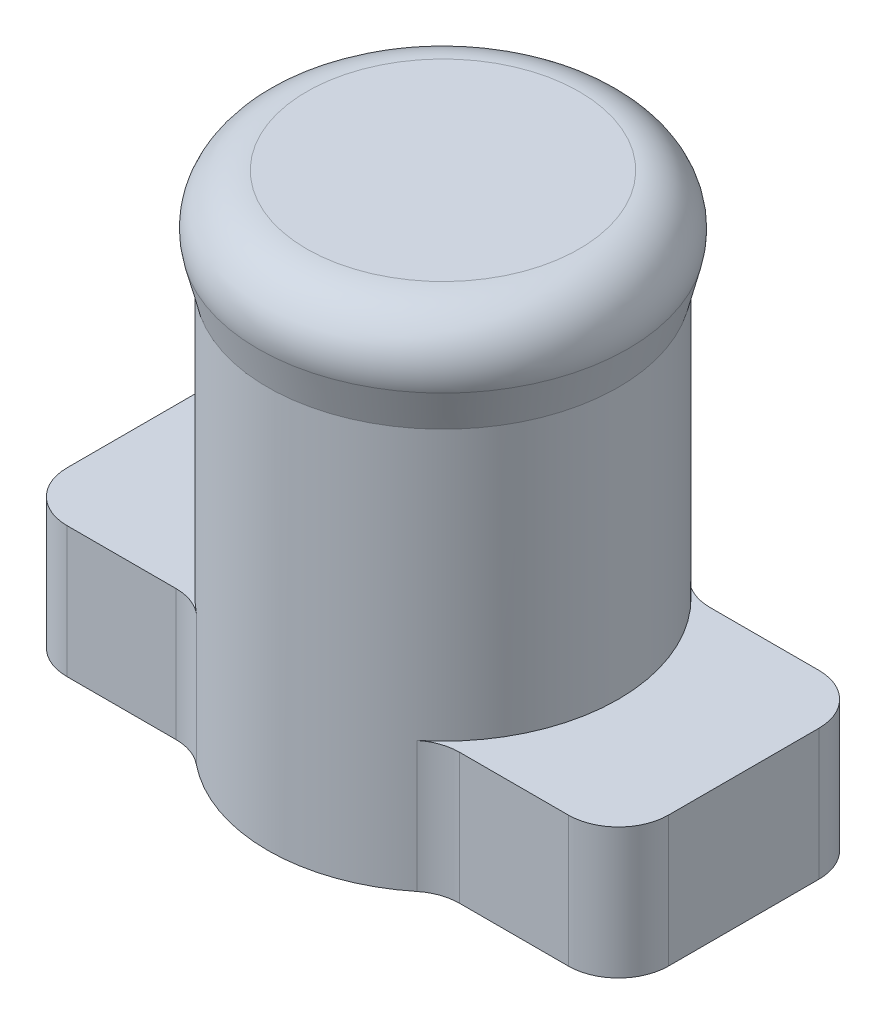
ISO-10303-21;
HEADER;
FILE_DESCRIPTION(('STEP AP214'),'2;1');
FILE_NAME('part.step','',(''),(''),'','','');
FILE_SCHEMA(('AUTOMOTIVE_DESIGN { 1 0 10303 214 1 1 1 1 }'));
ENDSEC;
DATA;
#1=APPLICATION_CONTEXT('core data for automotive mechanical design processes');
#2=APPLICATION_PROTOCOL_DEFINITION('international standard','automotive_design',2000,#1);
#3=PRODUCT_CONTEXT('',#1,'mechanical');
#4=PRODUCT('Part','Part','',(#3));
#5=PRODUCT_RELATED_PRODUCT_CATEGORY('part','',(#4));
#6=PRODUCT_DEFINITION_FORMATION('','',#4);
#7=PRODUCT_DEFINITION_CONTEXT('part definition',#1,'design');
#8=PRODUCT_DEFINITION('design','',#6,#7);
#9=PRODUCT_DEFINITION_SHAPE('','',#8);
#10=(LENGTH_UNIT() NAMED_UNIT(*) SI_UNIT(.MILLI.,.METRE.));
#11=(NAMED_UNIT(*) PLANE_ANGLE_UNIT() SI_UNIT($,.RADIAN.));
#12=(NAMED_UNIT(*) SI_UNIT($,.STERADIAN.) SOLID_ANGLE_UNIT());
#13=UNCERTAINTY_MEASURE_WITH_UNIT(LENGTH_MEASURE(1.E-05),#10,'distance_accuracy_value','');
#14=(GEOMETRIC_REPRESENTATION_CONTEXT(3) GLOBAL_UNCERTAINTY_ASSIGNED_CONTEXT((#13)) GLOBAL_UNIT_ASSIGNED_CONTEXT((#10,
#11,#12)) REPRESENTATION_CONTEXT('',''));
#15=CARTESIAN_POINT('',(0.,0.,0.));
#16=DIRECTION('',(0.,0.,1.));
#17=DIRECTION('',(1.,0.,0.));
#18=AXIS2_PLACEMENT_3D('',#15,#16,#17);
#19=CARTESIAN_POINT('',(0.,0.,0.));
#20=DIRECTION('',(0.,-1.,0.));
#21=DIRECTION('',(0.,0.,-1.));
#22=AXIS2_PLACEMENT_3D('',#19,#20,#21);
#23=CYLINDRICAL_SURFACE('',#22,3.5);
#24=CARTESIAN_POINT('',(0.,8.,0.));
#25=DIRECTION('',(0.,-1.,0.));
#26=DIRECTION('',(0.,0.,-1.));
#27=AXIS2_PLACEMENT_3D('',#24,#25,#26);
#28=CIRCLE('',#27,3.5);
#29=CARTESIAN_POINT('',(0.,8.,-3.5));
#30=VERTEX_POINT('',#29);
#31=EDGE_CURVE('E221',#30,#30,#28,.T.);
#32=ORIENTED_EDGE('',*,*,#31,.T.);
#33=EDGE_LOOP('',(#32));
#34=FACE_BOUND('',#33,.T.);
#35=CARTESIAN_POINT('',(0.,0.,0.));
#36=DIRECTION('',(0.,-1.,0.));
#37=DIRECTION('',(0.,0.,-1.));
#38=AXIS2_PLACEMENT_3D('',#35,#36,#37);
#39=CIRCLE('',#38,3.5);
#40=CARTESIAN_POINT('',(2.19988776369148,0.,2.72222222222222));
#41=VERTEX_POINT('',#40);
#42=CARTESIAN_POINT('',(-2.19988776369148,0.,2.72222222222222));
#43=VERTEX_POINT('',#42);
#44=EDGE_CURVE('E214',#41,#43,#39,.T.);
#45=ORIENTED_EDGE('',*,*,#44,.F.);
#46=DIRECTION('',(0.,-1.,0.));
#47=VECTOR('',#46,1.);
#48=CARTESIAN_POINT('',(2.19988776369148,0.,2.72222222222222));
#49=LINE('',#48,#47);
#50=CARTESIAN_POINT('',(2.19988776369148,2.61000000000006,2.72222222222222));
#51=VERTEX_POINT('',#50);
#52=EDGE_CURVE('E239',#41,#51,#49,.F.);
#53=ORIENTED_EDGE('',*,*,#52,.T.);
#54=CARTESIAN_POINT('',(0.,2.61000000000006,0.));
#55=DIRECTION('',(0.,1.,0.));
#56=DIRECTION('',(0.,0.,1.));
#57=AXIS2_PLACEMENT_3D('',#54,#55,#56);
#58=CIRCLE('',#57,3.5);
#59=CARTESIAN_POINT('',(2.19988776369148,2.61000000000006,-2.72222222222222));
#60=VERTEX_POINT('',#59);
#61=EDGE_CURVE('E323',#60,#51,#58,.F.);
#62=ORIENTED_EDGE('',*,*,#61,.F.);
#63=DIRECTION('',(0.,-1.,0.));
#64=VECTOR('',#63,1.);
#65=CARTESIAN_POINT('',(2.19988776369148,0.,-2.72222222222222));
#66=LINE('',#65,#64);
#67=CARTESIAN_POINT('',(2.19988776369148,0.,-2.72222222222222));
#68=VERTEX_POINT('',#67);
#69=EDGE_CURVE('E236',#60,#68,#66,.T.);
#70=ORIENTED_EDGE('',*,*,#69,.T.);
#71=CARTESIAN_POINT('',(-2.19988776369148,0.,-2.72222222222222));
#72=VERTEX_POINT('',#71);
#73=EDGE_CURVE('E218',#72,#68,#39,.T.);
#74=ORIENTED_EDGE('',*,*,#73,.F.);
#75=DIRECTION('',(0.,-1.,0.));
#76=VECTOR('',#75,1.);
#77=CARTESIAN_POINT('',(-2.19988776369148,0.,-2.72222222222222));
#78=LINE('',#77,#76);
#79=CARTESIAN_POINT('',(-2.19988776369148,2.61000000000006,-2.72222222222222));
#80=VERTEX_POINT('',#79);
#81=EDGE_CURVE('E233',#72,#80,#78,.F.);
#82=ORIENTED_EDGE('',*,*,#81,.T.);
#83=CARTESIAN_POINT('',(0.,2.61000000000006,0.));
#84=DIRECTION('',(0.,-1.,0.));
#85=DIRECTION('',(0.,0.,-1.));
#86=AXIS2_PLACEMENT_3D('',#83,#84,#85);
#87=CIRCLE('',#86,3.5);
#88=CARTESIAN_POINT('',(-2.19988776369148,2.61000000000006,2.72222222222222));
#89=VERTEX_POINT('',#88);
#90=EDGE_CURVE('E202',#80,#89,#87,.F.);
#91=ORIENTED_EDGE('',*,*,#90,.T.);
#92=DIRECTION('',(0.,-1.,0.));
#93=VECTOR('',#92,1.);
#94=CARTESIAN_POINT('',(-2.19988776369148,0.,2.72222222222222));
#95=LINE('',#94,#93);
#96=EDGE_CURVE('E230',#89,#43,#95,.T.);
#97=ORIENTED_EDGE('',*,*,#96,.T.);
#98=EDGE_LOOP('',(#45,#53,#62,#70,#74,#82,#91,#97));
#99=FACE_BOUND('',#98,.T.);
#100=ADVANCED_FACE('F33',(#34,#99),#23,.T.);
#101=CARTESIAN_POINT('',(3.5,0.,0.));
#102=DIRECTION('',(0.,-1.,0.));
#103=DIRECTION('',(0.,0.,-1.));
#104=AXIS2_PLACEMENT_3D('',#101,#102,#103);
#105=PLANE('',#104);
#106=DIRECTION('',(0.,0.,1.));
#107=VECTOR('',#106,1.);
#108=CARTESIAN_POINT('',(1.80000000000002,0.,-1.79999999999998));
#109=LINE('',#108,#107);
#110=CARTESIAN_POINT('',(1.80000000000002,0.,-1.79999999999998));
#111=VERTEX_POINT('',#110);
#112=CARTESIAN_POINT('',(1.80000000000002,0.,1.80000000000002));
#113=VERTEX_POINT('',#112);
#114=EDGE_CURVE('E179',#111,#113,#109,.T.);
#115=ORIENTED_EDGE('',*,*,#114,.F.);
#116=DIRECTION('',(1.,0.,0.));
#117=VECTOR('',#116,1.);
#118=CARTESIAN_POINT('',(-1.79999999999998,0.,-1.79999999999998));
#119=LINE('',#118,#117);
#120=CARTESIAN_POINT('',(-1.79999999999998,0.,-1.79999999999998));
#121=VERTEX_POINT('',#120);
#122=EDGE_CURVE('E196',#121,#111,#119,.T.);
#123=ORIENTED_EDGE('',*,*,#122,.F.);
#124=DIRECTION('',(0.,0.,-1.));
#125=VECTOR('',#124,1.);
#126=CARTESIAN_POINT('',(-1.79999999999998,0.,-1.79999999999998));
#127=LINE('',#126,#125);
#128=CARTESIAN_POINT('',(-1.79999999999998,0.,1.80000000000002));
#129=VERTEX_POINT('',#128);
#130=EDGE_CURVE('E199',#129,#121,#127,.T.);
#131=ORIENTED_EDGE('',*,*,#130,.F.);
#132=DIRECTION('',(-1.,0.,0.));
#133=VECTOR('',#132,1.);
#134=CARTESIAN_POINT('',(-1.79999999999998,0.,1.80000000000002));
#135=LINE('',#134,#133);
#136=EDGE_CURVE('E208',#113,#129,#135,.T.);
#137=ORIENTED_EDGE('',*,*,#136,.F.);
#138=EDGE_LOOP('',(#115,#123,#131,#137));
#139=FACE_BOUND('',#138,.T.);
#140=DIRECTION('',(0.,0.,-1.));
#141=VECTOR('',#140,1.);
#142=CARTESIAN_POINT('',(6.,0.,2.5));
#143=LINE('',#142,#141);
#144=CARTESIAN_POINT('',(6.,0.,1.5));
#145=VERTEX_POINT('',#144);
#146=CARTESIAN_POINT('',(6.,0.,-1.5));
#147=VERTEX_POINT('',#146);
#148=EDGE_CURVE('E409',#145,#147,#143,.T.);
#149=ORIENTED_EDGE('',*,*,#148,.F.);
#150=CARTESIAN_POINT('',(5.,0.,1.5));
#151=DIRECTION('',(0.,-1.,0.));
#152=DIRECTION('',(0.,0.,-1.));
#153=AXIS2_PLACEMENT_3D('',#150,#151,#152);
#154=CIRCLE('',#153,1.);
#155=CARTESIAN_POINT('',(5.,0.,2.5));
#156=VERTEX_POINT('',#155);
#157=EDGE_CURVE('E257',#145,#156,#154,.T.);
#158=ORIENTED_EDGE('',*,*,#157,.T.);
#159=DIRECTION('',(1.,0.,0.));
#160=VECTOR('',#159,1.);
#161=CARTESIAN_POINT('',(6.,0.,2.5));
#162=LINE('',#161,#160);
#163=CARTESIAN_POINT('',(2.82842712474619,0.,2.5));
#164=VERTEX_POINT('',#163);
#165=EDGE_CURVE('E415',#164,#156,#162,.T.);
#166=ORIENTED_EDGE('',*,*,#165,.F.);
#167=CARTESIAN_POINT('',(2.82842712474619,0.,3.5));
#168=DIRECTION('',(0.,-1.,0.));
#169=DIRECTION('',(0.,0.,-1.));
#170=AXIS2_PLACEMENT_3D('',#167,#168,#169);
#171=CIRCLE('',#170,1.);
#172=EDGE_CURVE('E286',#164,#41,#171,.F.);
#173=ORIENTED_EDGE('',*,*,#172,.T.);
#174=ORIENTED_EDGE('',*,*,#44,.T.);
#175=CARTESIAN_POINT('',(-2.82842712474619,0.,3.5));
#176=DIRECTION('',(0.,-1.,0.));
#177=DIRECTION('',(0.,0.,-1.));
#178=AXIS2_PLACEMENT_3D('',#175,#176,#177);
#179=CIRCLE('',#178,1.);
#180=CARTESIAN_POINT('',(-2.82842712474619,0.,2.5));
#181=VERTEX_POINT('',#180);
#182=EDGE_CURVE('E41',#43,#181,#179,.F.);
#183=ORIENTED_EDGE('',*,*,#182,.T.);
#184=DIRECTION('',(1.,0.,0.));
#185=VECTOR('',#184,1.);
#186=CARTESIAN_POINT('',(-1.79999999999998,0.,2.5));
#187=LINE('',#186,#185);
#188=CARTESIAN_POINT('',(-5.,0.,2.5));
#189=VERTEX_POINT('',#188);
#190=EDGE_CURVE('E301',#189,#181,#187,.T.);
#191=ORIENTED_EDGE('',*,*,#190,.F.);
#192=CARTESIAN_POINT('',(-5.,0.,1.5));
#193=DIRECTION('',(0.,-1.,0.));
#194=DIRECTION('',(0.,0.,-1.));
#195=AXIS2_PLACEMENT_3D('',#192,#193,#194);
#196=CIRCLE('',#195,1.);
#197=CARTESIAN_POINT('',(-6.,0.,1.5));
#198=VERTEX_POINT('',#197);
#199=EDGE_CURVE('E251',#189,#198,#196,.T.);
#200=ORIENTED_EDGE('',*,*,#199,.T.);
#201=DIRECTION('',(0.,0.,1.));
#202=VECTOR('',#201,1.);
#203=CARTESIAN_POINT('',(-6.,0.,-2.5));
#204=LINE('',#203,#202);
#205=CARTESIAN_POINT('',(-6.,0.,-1.5));
#206=VERTEX_POINT('',#205);
#207=EDGE_CURVE('E308',#206,#198,#204,.T.);
#208=ORIENTED_EDGE('',*,*,#207,.F.);
#209=CARTESIAN_POINT('',(-5.,0.,-1.5));
#210=DIRECTION('',(0.,-1.,0.));
#211=DIRECTION('',(0.,0.,-1.));
#212=AXIS2_PLACEMENT_3D('',#209,#210,#211);
#213=CIRCLE('',#212,1.);
#214=CARTESIAN_POINT('',(-5.,0.,-2.5));
#215=VERTEX_POINT('',#214);
#216=EDGE_CURVE('E253',#206,#215,#213,.T.);
#217=ORIENTED_EDGE('',*,*,#216,.T.);
#218=DIRECTION('',(-1.,0.,0.));
#219=VECTOR('',#218,1.);
#220=CARTESIAN_POINT('',(-1.79999999999998,0.,-2.5));
#221=LINE('',#220,#219);
#222=CARTESIAN_POINT('',(-2.82842712474619,0.,-2.5));
#223=VERTEX_POINT('',#222);
#224=EDGE_CURVE('E307',#223,#215,#221,.T.);
#225=ORIENTED_EDGE('',*,*,#224,.F.);
#226=CARTESIAN_POINT('',(-2.82842712474619,0.,-3.5));
#227=DIRECTION('',(0.,-1.,0.));
#228=DIRECTION('',(0.,0.,-1.));
#229=AXIS2_PLACEMENT_3D('',#226,#227,#228);
#230=CIRCLE('',#229,1.);
#231=EDGE_CURVE('E295',#223,#72,#230,.F.);
#232=ORIENTED_EDGE('',*,*,#231,.T.);
#233=ORIENTED_EDGE('',*,*,#73,.T.);
#234=CARTESIAN_POINT('',(2.82842712474619,0.,-3.5));
#235=DIRECTION('',(0.,-1.,0.));
#236=DIRECTION('',(0.,0.,-1.));
#237=AXIS2_PLACEMENT_3D('',#234,#235,#236);
#238=CIRCLE('',#237,1.);
#239=CARTESIAN_POINT('',(2.82842712474619,0.,-2.5));
#240=VERTEX_POINT('',#239);
#241=EDGE_CURVE('E288',#68,#240,#238,.F.);
#242=ORIENTED_EDGE('',*,*,#241,.T.);
#243=DIRECTION('',(-1.,0.,0.));
#244=VECTOR('',#243,1.);
#245=CARTESIAN_POINT('',(6.,0.,-2.5));
#246=LINE('',#245,#244);
#247=CARTESIAN_POINT('',(5.,0.,-2.5));
#248=VERTEX_POINT('',#247);
#249=EDGE_CURVE('E402',#248,#240,#246,.T.);
#250=ORIENTED_EDGE('',*,*,#249,.F.);
#251=CARTESIAN_POINT('',(5.,0.,-1.5));
#252=DIRECTION('',(0.,-1.,0.));
#253=DIRECTION('',(0.,0.,-1.));
#254=AXIS2_PLACEMENT_3D('',#251,#252,#253);
#255=CIRCLE('',#254,1.);
#256=EDGE_CURVE('E255',#248,#147,#255,.T.);
#257=ORIENTED_EDGE('',*,*,#256,.T.);
#258=EDGE_LOOP('',(#149,#158,#166,#173,#174,#183,#191,#200,#208,#217,#225,#232,#233,#242,#250,#257));
#259=FACE_BOUND('',#258,.T.);
#260=ADVANCED_FACE('F300',(#139,#259),#105,.T.);
#261=CARTESIAN_POINT('',(0.,10.,0.));
#262=DIRECTION('',(0.,1.,0.));
#263=DIRECTION('',(0.,0.,1.));
#264=AXIS2_PLACEMENT_3D('',#261,#262,#263);
#265=PLANE('',#264);
#266=CARTESIAN_POINT('',(0.,10.,0.));
#267=DIRECTION('',(0.,1.,0.));
#268=DIRECTION('',(0.,0.,1.));
#269=AXIS2_PLACEMENT_3D('',#266,#267,#268);
#270=CIRCLE('',#269,2.71922359359558);
#271=CARTESIAN_POINT('',(0.,10.,2.71922359359558));
#272=VERTEX_POINT('',#271);
#273=EDGE_CURVE('E227',#272,#272,#270,.T.);
#274=ORIENTED_EDGE('',*,*,#273,.T.);
#275=EDGE_LOOP('',(#274));
#276=FACE_BOUND('',#275,.T.);
#277=ADVANCED_FACE('F356',(#276),#265,.T.);
#278=CARTESIAN_POINT('',(0.,8.,0.));
#279=DIRECTION('',(0.,1.,0.));
#280=DIRECTION('',(0.,0.,1.));
#281=AXIS2_PLACEMENT_3D('',#278,#279,#280);
#282=CONICAL_SURFACE('',#281,3.5,0.244978663126864);
#283=CARTESIAN_POINT('',(0.,8.75746437496366,0.));
#284=DIRECTION('',(0.,-1.,0.));
#285=DIRECTION('',(0.,0.,-1.));
#286=AXIS2_PLACEMENT_3D('',#283,#284,#285);
#287=CIRCLE('',#286,3.68936609374092);
#288=CARTESIAN_POINT('',(0.,8.75746437496366,-3.68936609374092));
#289=VERTEX_POINT('',#288);
#290=EDGE_CURVE('E224',#289,#289,#287,.T.);
#291=ORIENTED_EDGE('',*,*,#290,.T.);
#292=EDGE_LOOP('',(#291));
#293=FACE_BOUND('',#292,.T.);
#294=ORIENTED_EDGE('',*,*,#31,.F.);
#295=EDGE_LOOP('',(#294));
#296=FACE_BOUND('',#295,.T.);
#297=ADVANCED_FACE('F363',(#293,#296),#282,.T.);
#298=CARTESIAN_POINT('',(1.80000000000002,3.5,-1.79999999999998));
#299=DIRECTION('',(1.,0.,0.));
#300=DIRECTION('',(0.,0.,-1.));
#301=AXIS2_PLACEMENT_3D('',#298,#299,#300);
#302=PLANE('',#301);
#303=DIRECTION('',(0.,-1.,0.));
#304=VECTOR('',#303,1.);
#305=CARTESIAN_POINT('',(1.80000000000002,3.5,-1.79999999999998));
#306=LINE('',#305,#304);
#307=CARTESIAN_POINT('',(1.80000000000002,3.5,-1.79999999999998));
#308=VERTEX_POINT('',#307);
#309=EDGE_CURVE('E212',#308,#111,#306,.T.);
#310=ORIENTED_EDGE('',*,*,#309,.T.);
#311=ORIENTED_EDGE('',*,*,#114,.T.);
#312=DIRECTION('',(0.,-1.,0.));
#313=VECTOR('',#312,1.);
#314=CARTESIAN_POINT('',(1.80000000000002,3.5,1.80000000000002));
#315=LINE('',#314,#313);
#316=CARTESIAN_POINT('',(1.80000000000002,3.5,1.80000000000002));
#317=VERTEX_POINT('',#316);
#318=EDGE_CURVE('E172',#317,#113,#315,.T.);
#319=ORIENTED_EDGE('',*,*,#318,.F.);
#320=DIRECTION('',(0.,0.,1.));
#321=VECTOR('',#320,1.);
#322=CARTESIAN_POINT('',(1.80000000000002,3.5,-1.79999999999998));
#323=LINE('',#322,#321);
#324=EDGE_CURVE('E176',#308,#317,#323,.T.);
#325=ORIENTED_EDGE('',*,*,#324,.F.);
#326=EDGE_LOOP('',(#310,#311,#319,#325));
#327=FACE_BOUND('',#326,.T.);
#328=ADVANCED_FACE('F174',(#327),#302,.F.);
#329=CARTESIAN_POINT('',(-1.79999999999998,3.5,-1.79999999999998));
#330=DIRECTION('',(0.,0.,-1.));
#331=DIRECTION('',(-1.,0.,0.));
#332=AXIS2_PLACEMENT_3D('',#329,#330,#331);
#333=PLANE('',#332);
#334=ORIENTED_EDGE('',*,*,#122,.T.);
#335=ORIENTED_EDGE('',*,*,#309,.F.);
#336=DIRECTION('',(1.,0.,0.));
#337=VECTOR('',#336,1.);
#338=CARTESIAN_POINT('',(-1.79999999999998,3.5,-1.79999999999998));
#339=LINE('',#338,#337);
#340=CARTESIAN_POINT('',(-1.79999999999998,3.5,-1.79999999999998));
#341=VERTEX_POINT('',#340);
#342=EDGE_CURVE('E184',#341,#308,#339,.T.);
#343=ORIENTED_EDGE('',*,*,#342,.F.);
#344=DIRECTION('',(0.,-1.,0.));
#345=VECTOR('',#344,1.);
#346=CARTESIAN_POINT('',(-1.79999999999998,3.5,-1.79999999999998));
#347=LINE('',#346,#345);
#348=EDGE_CURVE('E215',#341,#121,#347,.T.);
#349=ORIENTED_EDGE('',*,*,#348,.T.);
#350=EDGE_LOOP('',(#334,#335,#343,#349));
#351=FACE_BOUND('',#350,.T.);
#352=ADVANCED_FACE('F459',(#351),#333,.F.);
#353=CARTESIAN_POINT('',(-1.79999999999998,3.5,-1.79999999999998));
#354=DIRECTION('',(-1.,0.,0.));
#355=DIRECTION('',(0.,0.,1.));
#356=AXIS2_PLACEMENT_3D('',#353,#354,#355);
#357=PLANE('',#356);
#358=ORIENTED_EDGE('',*,*,#130,.T.);
#359=ORIENTED_EDGE('',*,*,#348,.F.);
#360=DIRECTION('',(0.,0.,-1.));
#361=VECTOR('',#360,1.);
#362=CARTESIAN_POINT('',(-1.79999999999998,3.5,-1.79999999999998));
#363=LINE('',#362,#361);
#364=CARTESIAN_POINT('',(-1.79999999999998,3.5,1.80000000000002));
#365=VERTEX_POINT('',#364);
#366=EDGE_CURVE('E192',#365,#341,#363,.T.);
#367=ORIENTED_EDGE('',*,*,#366,.F.);
#368=DIRECTION('',(0.,-1.,0.));
#369=VECTOR('',#368,1.);
#370=CARTESIAN_POINT('',(-1.79999999999998,3.5,1.80000000000002));
#371=LINE('',#370,#369);
#372=EDGE_CURVE('E183',#365,#129,#371,.T.);
#373=ORIENTED_EDGE('',*,*,#372,.T.);
#374=EDGE_LOOP('',(#358,#359,#367,#373));
#375=FACE_BOUND('',#374,.T.);
#376=ADVANCED_FACE('F462',(#375),#357,.F.);
#377=CARTESIAN_POINT('',(-1.79999999999998,3.5,1.80000000000002));
#378=DIRECTION('',(0.,0.,1.));
#379=DIRECTION('',(1.,0.,0.));
#380=AXIS2_PLACEMENT_3D('',#377,#378,#379);
#381=PLANE('',#380);
#382=ORIENTED_EDGE('',*,*,#136,.T.);
#383=ORIENTED_EDGE('',*,*,#372,.F.);
#384=DIRECTION('',(-1.,0.,0.));
#385=VECTOR('',#384,1.);
#386=CARTESIAN_POINT('',(-1.79999999999998,3.5,1.80000000000002));
#387=LINE('',#386,#385);
#388=EDGE_CURVE('E187',#317,#365,#387,.T.);
#389=ORIENTED_EDGE('',*,*,#388,.F.);
#390=ORIENTED_EDGE('',*,*,#318,.T.);
#391=EDGE_LOOP('',(#382,#383,#389,#390));
#392=FACE_BOUND('',#391,.T.);
#393=ADVANCED_FACE('F188',(#392),#381,.F.);
#394=CARTESIAN_POINT('',(0.,3.5,0.));
#395=DIRECTION('',(0.,1.,0.));
#396=DIRECTION('',(0.,0.,1.));
#397=AXIS2_PLACEMENT_3D('',#394,#395,#396);
#398=PLANE('',#397);
#399=ORIENTED_EDGE('',*,*,#324,.T.);
#400=ORIENTED_EDGE('',*,*,#388,.T.);
#401=ORIENTED_EDGE('',*,*,#366,.T.);
#402=ORIENTED_EDGE('',*,*,#342,.T.);
#403=EDGE_LOOP('',(#399,#400,#401,#402));
#404=FACE_BOUND('',#403,.T.);
#405=ADVANCED_FACE('F194',(#404),#398,.F.);
#406=CARTESIAN_POINT('',(-6.,2.61000000000006,-2.5));
#407=DIRECTION('',(1.,0.,0.));
#408=DIRECTION('',(0.,0.,-1.));
#409=AXIS2_PLACEMENT_3D('',#406,#407,#408);
#410=PLANE('',#409);
#411=DIRECTION('',(0.,0.,1.));
#412=VECTOR('',#411,1.);
#413=CARTESIAN_POINT('',(-6.,2.61000000000006,-2.5));
#414=LINE('',#413,#412);
#415=CARTESIAN_POINT('',(-6.,2.61000000000006,-1.5));
#416=VERTEX_POINT('',#415);
#417=CARTESIAN_POINT('',(-6.,2.61000000000006,1.5));
#418=VERTEX_POINT('',#417);
#419=EDGE_CURVE('E316',#416,#418,#414,.T.);
#420=ORIENTED_EDGE('',*,*,#419,.F.);
#421=DIRECTION('',(0.,-1.,0.));
#422=VECTOR('',#421,1.);
#423=CARTESIAN_POINT('',(-6.,2.61000000000006,-1.5));
#424=LINE('',#423,#422);
#425=EDGE_CURVE('E274',#416,#206,#424,.T.);
#426=ORIENTED_EDGE('',*,*,#425,.T.);
#427=ORIENTED_EDGE('',*,*,#207,.T.);
#428=DIRECTION('',(0.,-1.,0.));
#429=VECTOR('',#428,1.);
#430=CARTESIAN_POINT('',(-6.,2.61000000000006,1.5));
#431=LINE('',#430,#429);
#432=EDGE_CURVE('E272',#198,#418,#431,.F.);
#433=ORIENTED_EDGE('',*,*,#432,.T.);
#434=EDGE_LOOP('',(#420,#426,#427,#433));
#435=FACE_BOUND('',#434,.T.);
#436=ADVANCED_FACE('F338',(#435),#410,.F.);
#437=CARTESIAN_POINT('',(-1.79999999999998,2.61000000000006,2.5));
#438=DIRECTION('',(0.,0.,-1.));
#439=DIRECTION('',(-1.,0.,0.));
#440=AXIS2_PLACEMENT_3D('',#437,#438,#439);
#441=PLANE('',#440);
#442=DIRECTION('',(1.,0.,0.));
#443=VECTOR('',#442,1.);
#444=CARTESIAN_POINT('',(-1.79999999999998,2.61000000000006,2.5));
#445=LINE('',#444,#443);
#446=CARTESIAN_POINT('',(-5.,2.61000000000006,2.5));
#447=VERTEX_POINT('',#446);
#448=CARTESIAN_POINT('',(-2.82842712474619,2.61000000000006,2.5));
#449=VERTEX_POINT('',#448);
#450=EDGE_CURVE('E314',#447,#449,#445,.T.);
#451=ORIENTED_EDGE('',*,*,#450,.F.);
#452=DIRECTION('',(0.,-1.,0.));
#453=VECTOR('',#452,1.);
#454=CARTESIAN_POINT('',(-5.,2.61000000000006,2.5));
#455=LINE('',#454,#453);
#456=EDGE_CURVE('E281',#447,#189,#455,.T.);
#457=ORIENTED_EDGE('',*,*,#456,.T.);
#458=ORIENTED_EDGE('',*,*,#190,.T.);
#459=DIRECTION('',(0.,-1.,0.));
#460=VECTOR('',#459,1.);
#461=CARTESIAN_POINT('',(-2.82842712474619,2.61000000000006,2.5));
#462=LINE('',#461,#460);
#463=EDGE_CURVE('E48',#181,#449,#462,.F.);
#464=ORIENTED_EDGE('',*,*,#463,.T.);
#465=EDGE_LOOP('',(#451,#457,#458,#464));
#466=FACE_BOUND('',#465,.T.);
#467=ADVANCED_FACE('F305',(#466),#441,.F.);
#468=CARTESIAN_POINT('',(-1.79999999999998,2.61000000000006,-2.5));
#469=DIRECTION('',(0.,0.,1.));
#470=DIRECTION('',(1.,0.,0.));
#471=AXIS2_PLACEMENT_3D('',#468,#469,#470);
#472=PLANE('',#471);
#473=DIRECTION('',(-1.,0.,0.));
#474=VECTOR('',#473,1.);
#475=CARTESIAN_POINT('',(-1.79999999999998,2.61000000000006,-2.5));
#476=LINE('',#475,#474);
#477=CARTESIAN_POINT('',(-2.82842712474619,2.61000000000006,-2.5));
#478=VERTEX_POINT('',#477);
#479=CARTESIAN_POINT('',(-5.,2.61000000000006,-2.5));
#480=VERTEX_POINT('',#479);
#481=EDGE_CURVE('E315',#478,#480,#476,.T.);
#482=ORIENTED_EDGE('',*,*,#481,.F.);
#483=DIRECTION('',(0.,-1.,0.));
#484=VECTOR('',#483,1.);
#485=CARTESIAN_POINT('',(-2.82842712474619,2.61000000000006,-2.5));
#486=LINE('',#485,#484);
#487=EDGE_CURVE('E270',#478,#223,#486,.T.);
#488=ORIENTED_EDGE('',*,*,#487,.T.);
#489=ORIENTED_EDGE('',*,*,#224,.T.);
#490=DIRECTION('',(0.,-1.,0.));
#491=VECTOR('',#490,1.);
#492=CARTESIAN_POINT('',(-5.,2.61000000000006,-2.5));
#493=LINE('',#492,#491);
#494=EDGE_CURVE('E268',#215,#480,#493,.F.);
#495=ORIENTED_EDGE('',*,*,#494,.T.);
#496=EDGE_LOOP('',(#482,#488,#489,#495));
#497=FACE_BOUND('',#496,.T.);
#498=ADVANCED_FACE('F329',(#497),#472,.F.);
#499=CARTESIAN_POINT('',(0.,2.61000000000006,0.));
#500=DIRECTION('',(0.,-1.,0.));
#501=DIRECTION('',(0.,0.,-1.));
#502=AXIS2_PLACEMENT_3D('',#499,#500,#501);
#503=PLANE('',#502);
#504=ORIENTED_EDGE('',*,*,#481,.T.);
#505=CARTESIAN_POINT('',(-5.,2.61000000000006,-1.5));
#506=DIRECTION('',(0.,-1.,0.));
#507=DIRECTION('',(0.,0.,-1.));
#508=AXIS2_PLACEMENT_3D('',#505,#506,#507);
#509=CIRCLE('',#508,1.);
#510=EDGE_CURVE('E278',#480,#416,#509,.F.);
#511=ORIENTED_EDGE('',*,*,#510,.T.);
#512=ORIENTED_EDGE('',*,*,#419,.T.);
#513=CARTESIAN_POINT('',(-5.,2.61000000000006,1.5));
#514=DIRECTION('',(0.,-1.,0.));
#515=DIRECTION('',(0.,0.,-1.));
#516=AXIS2_PLACEMENT_3D('',#513,#514,#515);
#517=CIRCLE('',#516,1.);
#518=EDGE_CURVE('E55',#418,#447,#517,.F.);
#519=ORIENTED_EDGE('',*,*,#518,.T.);
#520=ORIENTED_EDGE('',*,*,#450,.T.);
#521=CARTESIAN_POINT('',(-2.82842712474619,2.61000000000006,3.5));
#522=DIRECTION('',(0.,-1.,0.));
#523=DIRECTION('',(0.,0.,-1.));
#524=AXIS2_PLACEMENT_3D('',#521,#522,#523);
#525=CIRCLE('',#524,1.);
#526=EDGE_CURVE('E11',#449,#89,#525,.T.);
#527=ORIENTED_EDGE('',*,*,#526,.T.);
#528=ORIENTED_EDGE('',*,*,#90,.F.);
#529=CARTESIAN_POINT('',(-2.82842712474619,2.61000000000006,-3.5));
#530=DIRECTION('',(0.,-1.,0.));
#531=DIRECTION('',(0.,0.,-1.));
#532=AXIS2_PLACEMENT_3D('',#529,#530,#531);
#533=CIRCLE('',#532,1.);
#534=EDGE_CURVE('E293',#80,#478,#533,.T.);
#535=ORIENTED_EDGE('',*,*,#534,.T.);
#536=EDGE_LOOP('',(#504,#511,#512,#519,#520,#527,#528,#535));
#537=FACE_BOUND('',#536,.T.);
#538=ADVANCED_FACE('F312',(#537),#503,.F.);
#539=CARTESIAN_POINT('',(6.,2.61000000000006,2.5));
#540=DIRECTION('',(0.,0.,-1.));
#541=DIRECTION('',(-1.,0.,0.));
#542=AXIS2_PLACEMENT_3D('',#539,#540,#541);
#543=PLANE('',#542);
#544=DIRECTION('',(1.,0.,0.));
#545=VECTOR('',#544,1.);
#546=CARTESIAN_POINT('',(6.,2.61000000000006,2.5));
#547=LINE('',#546,#545);
#548=CARTESIAN_POINT('',(2.82842712474619,2.61000000000006,2.5));
#549=VERTEX_POINT('',#548);
#550=CARTESIAN_POINT('',(5.,2.61000000000006,2.5));
#551=VERTEX_POINT('',#550);
#552=EDGE_CURVE('E408',#549,#551,#547,.T.);
#553=ORIENTED_EDGE('',*,*,#552,.F.);
#554=DIRECTION('',(0.,-1.,0.));
#555=VECTOR('',#554,1.);
#556=CARTESIAN_POINT('',(2.82842712474619,2.61000000000006,2.5));
#557=LINE('',#556,#555);
#558=EDGE_CURVE('E244',#549,#164,#557,.T.);
#559=ORIENTED_EDGE('',*,*,#558,.T.);
#560=ORIENTED_EDGE('',*,*,#165,.T.);
#561=DIRECTION('',(0.,-1.,0.));
#562=VECTOR('',#561,1.);
#563=CARTESIAN_POINT('',(5.,2.61000000000006,2.5));
#564=LINE('',#563,#562);
#565=EDGE_CURVE('E242',#156,#551,#564,.F.);
#566=ORIENTED_EDGE('',*,*,#565,.T.);
#567=EDGE_LOOP('',(#553,#559,#560,#566));
#568=FACE_BOUND('',#567,.T.);
#569=ADVANCED_FACE('F429',(#568),#543,.F.);
#570=CARTESIAN_POINT('',(6.,2.61000000000006,2.5));
#571=DIRECTION('',(-1.,0.,0.));
#572=DIRECTION('',(0.,0.,1.));
#573=AXIS2_PLACEMENT_3D('',#570,#571,#572);
#574=PLANE('',#573);
#575=DIRECTION('',(0.,0.,-1.));
#576=VECTOR('',#575,1.);
#577=CARTESIAN_POINT('',(6.,2.61000000000006,2.5));
#578=LINE('',#577,#576);
#579=CARTESIAN_POINT('',(6.,2.61000000000006,1.5));
#580=VERTEX_POINT('',#579);
#581=CARTESIAN_POINT('',(6.,2.61000000000006,-1.5));
#582=VERTEX_POINT('',#581);
#583=EDGE_CURVE('E412',#580,#582,#578,.T.);
#584=ORIENTED_EDGE('',*,*,#583,.F.);
#585=DIRECTION('',(0.,-1.,0.));
#586=VECTOR('',#585,1.);
#587=CARTESIAN_POINT('',(6.,2.61000000000006,1.5));
#588=LINE('',#587,#586);
#589=EDGE_CURVE('E248',#580,#145,#588,.T.);
#590=ORIENTED_EDGE('',*,*,#589,.T.);
#591=ORIENTED_EDGE('',*,*,#148,.T.);
#592=DIRECTION('',(0.,-1.,0.));
#593=VECTOR('',#592,1.);
#594=CARTESIAN_POINT('',(6.,2.61000000000006,-1.5));
#595=LINE('',#594,#593);
#596=EDGE_CURVE('E246',#147,#582,#595,.F.);
#597=ORIENTED_EDGE('',*,*,#596,.T.);
#598=EDGE_LOOP('',(#584,#590,#591,#597));
#599=FACE_BOUND('',#598,.T.);
#600=ADVANCED_FACE('F437',(#599),#574,.F.);
#601=CARTESIAN_POINT('',(6.,2.61000000000006,-2.5));
#602=DIRECTION('',(0.,0.,1.));
#603=DIRECTION('',(1.,0.,0.));
#604=AXIS2_PLACEMENT_3D('',#601,#602,#603);
#605=PLANE('',#604);
#606=DIRECTION('',(-1.,0.,0.));
#607=VECTOR('',#606,1.);
#608=CARTESIAN_POINT('',(6.,2.61000000000006,-2.5));
#609=LINE('',#608,#607);
#610=CARTESIAN_POINT('',(5.,2.61000000000006,-2.5));
#611=VERTEX_POINT('',#610);
#612=CARTESIAN_POINT('',(2.82842712474619,2.61000000000006,-2.5));
#613=VERTEX_POINT('',#612);
#614=EDGE_CURVE('E418',#611,#613,#609,.T.);
#615=ORIENTED_EDGE('',*,*,#614,.F.);
#616=DIRECTION('',(0.,-1.,0.));
#617=VECTOR('',#616,1.);
#618=CARTESIAN_POINT('',(5.,2.61000000000006,-2.5));
#619=LINE('',#618,#617);
#620=EDGE_CURVE('E265',#611,#248,#619,.T.);
#621=ORIENTED_EDGE('',*,*,#620,.T.);
#622=ORIENTED_EDGE('',*,*,#249,.T.);
#623=DIRECTION('',(0.,-1.,0.));
#624=VECTOR('',#623,1.);
#625=CARTESIAN_POINT('',(2.82842712474619,2.61000000000006,-2.5));
#626=LINE('',#625,#624);
#627=EDGE_CURVE('E263',#240,#613,#626,.F.);
#628=ORIENTED_EDGE('',*,*,#627,.T.);
#629=EDGE_LOOP('',(#615,#621,#622,#628));
#630=FACE_BOUND('',#629,.T.);
#631=ADVANCED_FACE('F405',(#630),#605,.F.);
#632=CARTESIAN_POINT('',(0.,2.61000000000006,0.));
#633=DIRECTION('',(0.,1.,0.));
#634=DIRECTION('',(0.,0.,1.));
#635=AXIS2_PLACEMENT_3D('',#632,#633,#634);
#636=PLANE('',#635);
#637=ORIENTED_EDGE('',*,*,#552,.T.);
#638=CARTESIAN_POINT('',(5.,2.61000000000006,1.5));
#639=DIRECTION('',(0.,1.,0.));
#640=DIRECTION('',(0.,0.,1.));
#641=AXIS2_PLACEMENT_3D('',#638,#639,#640);
#642=CIRCLE('',#641,1.);
#643=EDGE_CURVE('E261',#551,#580,#642,.T.);
#644=ORIENTED_EDGE('',*,*,#643,.T.);
#645=ORIENTED_EDGE('',*,*,#583,.T.);
#646=CARTESIAN_POINT('',(5.,2.61000000000006,-1.5));
#647=DIRECTION('',(0.,1.,0.));
#648=DIRECTION('',(0.,0.,1.));
#649=AXIS2_PLACEMENT_3D('',#646,#647,#648);
#650=CIRCLE('',#649,1.);
#651=EDGE_CURVE('E259',#582,#611,#650,.T.);
#652=ORIENTED_EDGE('',*,*,#651,.T.);
#653=ORIENTED_EDGE('',*,*,#614,.T.);
#654=CARTESIAN_POINT('',(2.82842712474619,2.61000000000006,-3.5));
#655=DIRECTION('',(0.,1.,0.));
#656=DIRECTION('',(0.,0.,1.));
#657=AXIS2_PLACEMENT_3D('',#654,#655,#656);
#658=CIRCLE('',#657,1.);
#659=EDGE_CURVE('E290',#613,#60,#658,.F.);
#660=ORIENTED_EDGE('',*,*,#659,.T.);
#661=ORIENTED_EDGE('',*,*,#61,.T.);
#662=CARTESIAN_POINT('',(2.82842712474619,2.61000000000006,3.5));
#663=DIRECTION('',(0.,1.,0.));
#664=DIRECTION('',(0.,0.,1.));
#665=AXIS2_PLACEMENT_3D('',#662,#663,#664);
#666=CIRCLE('',#665,1.);
#667=EDGE_CURVE('E284',#51,#549,#666,.F.);
#668=ORIENTED_EDGE('',*,*,#667,.T.);
#669=EDGE_LOOP('',(#637,#644,#645,#652,#653,#660,#661,#668));
#670=FACE_BOUND('',#669,.T.);
#671=ADVANCED_FACE('F374',(#670),#636,.T.);
#672=CARTESIAN_POINT('',(0.,9.,0.));
#673=DIRECTION('',(0.,1.,0.));
#674=DIRECTION('',(0.,0.,1.));
#675=AXIS2_PLACEMENT_3D('',#672,#673,#674);
#676=TOROIDAL_SURFACE('',#675,2.71922359359558,1.);
#677=ORIENTED_EDGE('',*,*,#273,.F.);
#678=EDGE_LOOP('',(#677));
#679=FACE_BOUND('',#678,.T.);
#680=ORIENTED_EDGE('',*,*,#290,.F.);
#681=EDGE_LOOP('',(#680));
#682=FACE_BOUND('',#681,.T.);
#683=ADVANCED_FACE('F370',(#679,#682),#676,.T.);
#684=CARTESIAN_POINT('',(2.82842712474619,0.,3.5));
#685=DIRECTION('',(0.,-1.,0.));
#686=DIRECTION('',(0.,0.,-1.));
#687=AXIS2_PLACEMENT_3D('',#684,#685,#686);
#688=CYLINDRICAL_SURFACE('',#687,1.);
#689=ORIENTED_EDGE('',*,*,#172,.F.);
#690=ORIENTED_EDGE('',*,*,#558,.F.);
#691=ORIENTED_EDGE('',*,*,#667,.F.);
#692=ORIENTED_EDGE('',*,*,#52,.F.);
#693=EDGE_LOOP('',(#689,#690,#691,#692));
#694=FACE_BOUND('',#693,.T.);
#695=ADVANCED_FACE('F373',(#694),#688,.F.);
#696=CARTESIAN_POINT('',(5.,2.61000000000006,1.5));
#697=DIRECTION('',(0.,-1.,0.));
#698=DIRECTION('',(0.,0.,-1.));
#699=AXIS2_PLACEMENT_3D('',#696,#697,#698);
#700=CYLINDRICAL_SURFACE('',#699,1.);
#701=ORIENTED_EDGE('',*,*,#643,.F.);
#702=ORIENTED_EDGE('',*,*,#565,.F.);
#703=ORIENTED_EDGE('',*,*,#157,.F.);
#704=ORIENTED_EDGE('',*,*,#589,.F.);
#705=EDGE_LOOP('',(#701,#702,#703,#704));
#706=FACE_BOUND('',#705,.T.);
#707=ADVANCED_FACE('F378',(#706),#700,.T.);
#708=CARTESIAN_POINT('',(5.,2.61000000000006,-1.5));
#709=DIRECTION('',(0.,-1.,0.));
#710=DIRECTION('',(0.,0.,-1.));
#711=AXIS2_PLACEMENT_3D('',#708,#709,#710);
#712=CYLINDRICAL_SURFACE('',#711,1.);
#713=ORIENTED_EDGE('',*,*,#651,.F.);
#714=ORIENTED_EDGE('',*,*,#596,.F.);
#715=ORIENTED_EDGE('',*,*,#256,.F.);
#716=ORIENTED_EDGE('',*,*,#620,.F.);
#717=EDGE_LOOP('',(#713,#714,#715,#716));
#718=FACE_BOUND('',#717,.T.);
#719=ADVANCED_FACE('F382',(#718),#712,.T.);
#720=CARTESIAN_POINT('',(2.82842712474619,0.,-3.5));
#721=DIRECTION('',(0.,-1.,0.));
#722=DIRECTION('',(0.,0.,-1.));
#723=AXIS2_PLACEMENT_3D('',#720,#721,#722);
#724=CYLINDRICAL_SURFACE('',#723,1.);
#725=ORIENTED_EDGE('',*,*,#659,.F.);
#726=ORIENTED_EDGE('',*,*,#627,.F.);
#727=ORIENTED_EDGE('',*,*,#241,.F.);
#728=ORIENTED_EDGE('',*,*,#69,.F.);
#729=EDGE_LOOP('',(#725,#726,#727,#728));
#730=FACE_BOUND('',#729,.T.);
#731=ADVANCED_FACE('F386',(#730),#724,.F.);
#732=CARTESIAN_POINT('',(-2.82842712474619,0.,-3.5));
#733=DIRECTION('',(0.,-1.,0.));
#734=DIRECTION('',(0.,0.,-1.));
#735=AXIS2_PLACEMENT_3D('',#732,#733,#734);
#736=CYLINDRICAL_SURFACE('',#735,1.);
#737=ORIENTED_EDGE('',*,*,#231,.F.);
#738=ORIENTED_EDGE('',*,*,#487,.F.);
#739=ORIENTED_EDGE('',*,*,#534,.F.);
#740=ORIENTED_EDGE('',*,*,#81,.F.);
#741=EDGE_LOOP('',(#737,#738,#739,#740));
#742=FACE_BOUND('',#741,.T.);
#743=ADVANCED_FACE('F348',(#742),#736,.F.);
#744=CARTESIAN_POINT('',(-5.,2.61000000000006,-1.5));
#745=DIRECTION('',(0.,-1.,0.));
#746=DIRECTION('',(0.,0.,-1.));
#747=AXIS2_PLACEMENT_3D('',#744,#745,#746);
#748=CYLINDRICAL_SURFACE('',#747,1.);
#749=ORIENTED_EDGE('',*,*,#510,.F.);
#750=ORIENTED_EDGE('',*,*,#494,.F.);
#751=ORIENTED_EDGE('',*,*,#216,.F.);
#752=ORIENTED_EDGE('',*,*,#425,.F.);
#753=EDGE_LOOP('',(#749,#750,#751,#752));
#754=FACE_BOUND('',#753,.T.);
#755=ADVANCED_FACE('F334',(#754),#748,.T.);
#756=CARTESIAN_POINT('',(-5.,2.61000000000006,1.5));
#757=DIRECTION('',(0.,-1.,0.));
#758=DIRECTION('',(0.,0.,-1.));
#759=AXIS2_PLACEMENT_3D('',#756,#757,#758);
#760=CYLINDRICAL_SURFACE('',#759,1.);
#761=ORIENTED_EDGE('',*,*,#518,.F.);
#762=ORIENTED_EDGE('',*,*,#432,.F.);
#763=ORIENTED_EDGE('',*,*,#199,.F.);
#764=ORIENTED_EDGE('',*,*,#456,.F.);
#765=EDGE_LOOP('',(#761,#762,#763,#764));
#766=FACE_BOUND('',#765,.T.);
#767=ADVANCED_FACE('F342',(#766),#760,.T.);
#768=CARTESIAN_POINT('',(-2.82842712474619,0.,3.5));
#769=DIRECTION('',(0.,-1.,0.));
#770=DIRECTION('',(0.,0.,-1.));
#771=AXIS2_PLACEMENT_3D('',#768,#769,#770);
#772=CYLINDRICAL_SURFACE('',#771,1.);
#773=ORIENTED_EDGE('',*,*,#526,.F.);
#774=ORIENTED_EDGE('',*,*,#463,.F.);
#775=ORIENTED_EDGE('',*,*,#182,.F.);
#776=ORIENTED_EDGE('',*,*,#96,.F.);
#777=EDGE_LOOP('',(#773,#774,#775,#776));
#778=FACE_BOUND('',#777,.T.);
#779=ADVANCED_FACE('F35',(#778),#772,.F.);
#780=CLOSED_SHELL('',(#100,#260,#277,#297,#328,#352,#376,#393,#405,#436,#467,#498,#538,#569,
#600,#631,#671,#683,#695,#707,#719,#731,#743,#755,#767,#779));
#781=MANIFOLD_SOLID_BREP('B2',#780);
#782=ADVANCED_BREP_SHAPE_REPRESENTATION('',(#18,#781),#14);
#783=SHAPE_DEFINITION_REPRESENTATION(#9,#782);
ENDSEC;
END-ISO-10303-21;
